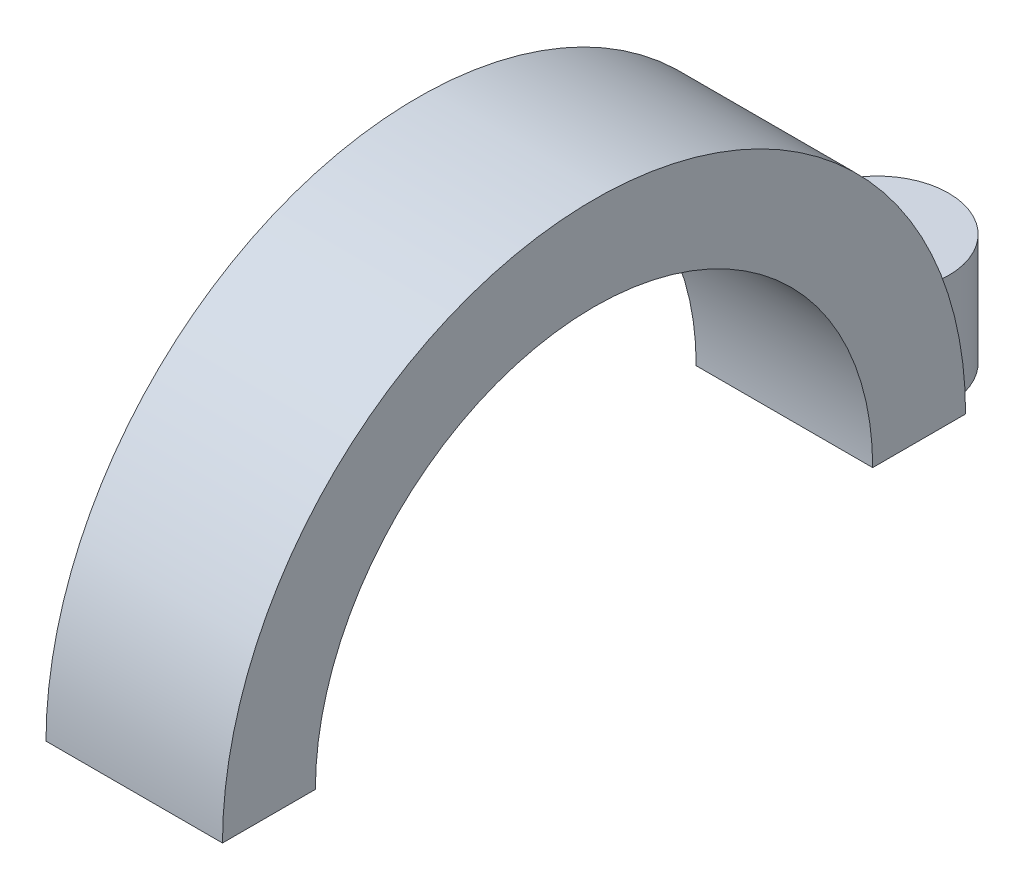
ISO-10303-21;
HEADER;
FILE_DESCRIPTION(('STEP AP214'),'2;1');
FILE_NAME('part.step','',(''),(''),'','','');
FILE_SCHEMA(('AUTOMOTIVE_DESIGN { 1 0 10303 214 1 1 1 1 }'));
ENDSEC;
DATA;
#1=APPLICATION_CONTEXT('core data for automotive mechanical design processes');
#2=APPLICATION_PROTOCOL_DEFINITION('international standard','automotive_design',2000,#1);
#3=PRODUCT_CONTEXT('',#1,'mechanical');
#4=PRODUCT('Part','Part','',(#3));
#5=PRODUCT_RELATED_PRODUCT_CATEGORY('part','',(#4));
#6=PRODUCT_DEFINITION_FORMATION('','',#4);
#7=PRODUCT_DEFINITION_CONTEXT('part definition',#1,'design');
#8=PRODUCT_DEFINITION('design','',#6,#7);
#9=PRODUCT_DEFINITION_SHAPE('','',#8);
#10=(LENGTH_UNIT() NAMED_UNIT(*) SI_UNIT(.MILLI.,.METRE.));
#11=(NAMED_UNIT(*) PLANE_ANGLE_UNIT() SI_UNIT($,.RADIAN.));
#12=(NAMED_UNIT(*) SI_UNIT($,.STERADIAN.) SOLID_ANGLE_UNIT());
#13=UNCERTAINTY_MEASURE_WITH_UNIT(LENGTH_MEASURE(1.E-05),#10,'distance_accuracy_value','');
#14=(GEOMETRIC_REPRESENTATION_CONTEXT(3) GLOBAL_UNCERTAINTY_ASSIGNED_CONTEXT((#13)) GLOBAL_UNIT_ASSIGNED_CONTEXT((#10,
#11,#12)) REPRESENTATION_CONTEXT('',''));
#15=CARTESIAN_POINT('',(0.,0.,0.));
#16=DIRECTION('',(0.,0.,1.));
#17=DIRECTION('',(1.,0.,0.));
#18=AXIS2_PLACEMENT_3D('',#15,#16,#17);
#19=CARTESIAN_POINT('',(120.65,0.,0.));
#20=DIRECTION('',(0.,1.,0.));
#21=DIRECTION('',(0.,0.,1.));
#22=AXIS2_PLACEMENT_3D('',#19,#20,#21);
#23=PLANE('',#22);
#24=DIRECTION('',(-1.,0.,0.));
#25=VECTOR('',#24,1.);
#26=CARTESIAN_POINT('',(120.65,0.,-508.));
#27=LINE('',#26,#25);
#28=CARTESIAN_POINT('',(-97.5,0.,-508.));
#29=VERTEX_POINT('',#28);
#30=CARTESIAN_POINT('',(-120.65,0.,-508.));
#31=VERTEX_POINT('',#30);
#32=EDGE_CURVE('E95',#29,#31,#27,.T.);
#33=ORIENTED_EDGE('',*,*,#32,.F.);
#34=CARTESIAN_POINT('',(0.,0.,-508.));
#35=DIRECTION('',(0.,-1.,0.));
#36=DIRECTION('',(0.,0.,-1.));
#37=AXIS2_PLACEMENT_3D('',#34,#35,#36);
#38=CIRCLE('',#37,97.5);
#39=CARTESIAN_POINT('',(97.5,0.,-508.));
#40=VERTEX_POINT('',#39);
#41=EDGE_CURVE('E98',#29,#40,#38,.T.);
#42=ORIENTED_EDGE('',*,*,#41,.T.);
#43=CARTESIAN_POINT('',(120.65,0.,-508.));
#44=VERTEX_POINT('',#43);
#45=EDGE_CURVE('E102',#44,#40,#27,.T.);
#46=ORIENTED_EDGE('',*,*,#45,.F.);
#47=DIRECTION('',(0.,0.,-1.));
#48=VECTOR('',#47,1.);
#49=CARTESIAN_POINT('',(120.65,0.,0.));
#50=LINE('',#49,#48);
#51=CARTESIAN_POINT('',(120.65,0.,-381.));
#52=VERTEX_POINT('',#51);
#53=EDGE_CURVE('E113',#52,#44,#50,.T.);
#54=ORIENTED_EDGE('',*,*,#53,.F.);
#55=DIRECTION('',(-1.,0.,0.));
#56=VECTOR('',#55,1.);
#57=CARTESIAN_POINT('',(120.65,0.,-381.));
#58=LINE('',#57,#56);
#59=CARTESIAN_POINT('',(-120.65,0.,-381.));
#60=VERTEX_POINT('',#59);
#61=EDGE_CURVE('E123',#52,#60,#58,.T.);
#62=ORIENTED_EDGE('',*,*,#61,.T.);
#63=DIRECTION('',(0.,0.,-1.));
#64=VECTOR('',#63,1.);
#65=CARTESIAN_POINT('',(-120.65,0.,0.));
#66=LINE('',#65,#64);
#67=EDGE_CURVE('E100',#60,#31,#66,.T.);
#68=ORIENTED_EDGE('',*,*,#67,.T.);
#69=EDGE_LOOP('',(#33,#42,#46,#54,#62,#68));
#70=FACE_BOUND('',#69,.T.);
#71=ADVANCED_FACE('F39',(#70),#23,.F.);
#72=CARTESIAN_POINT('',(120.65,0.,0.));
#73=DIRECTION('',(-1.,0.,0.));
#74=DIRECTION('',(0.,0.,1.));
#75=AXIS2_PLACEMENT_3D('',#72,#73,#74);
#76=CYLINDRICAL_SURFACE('',#75,508.);
#77=ORIENTED_EDGE('',*,*,#45,.T.);
#78=CARTESIAN_POINT('',(97.5,0.,-508.));
#79=CARTESIAN_POINT('',(97.4999970931986,1.61886356008947,-507.999999981574));
#80=CARTESIAN_POINT('',(97.5000003888945,3.23771696442745,-507.992261593465));
#81=CARTESIAN_POINT('',(97.4999940837196,6.475273841626,-507.961309102363));
#82=CARTESIAN_POINT('',(97.4999844828645,8.09397731466719,-507.938095018262));
#83=CARTESIAN_POINT('',(97.499898383887,12.9496402434581,-507.845241382301));
#84=CARTESIAN_POINT('',(97.4997645903566,16.1861863132922,-507.752390446735));
#85=CARTESIAN_POINT('',(97.4988207270217,22.6568386933033,-507.504827901568));
#86=CARTESIAN_POINT('',(97.4980106678843,25.8909450411578,-507.350117267733));
#87=CARTESIAN_POINT('',(97.4948296852726,32.3556132574334,-506.978891706361));
#88=CARTESIAN_POINT('',(97.4924587622608,35.5861751269043,-506.762376797138));
#89=CARTESIAN_POINT('',(97.4849450009961,42.0230465401967,-506.269117824298));
#90=CARTESIAN_POINT('',(97.4798190077263,45.22938462686,-505.992745805322));
#91=CARTESIAN_POINT('',(97.4652511796013,51.6362205137568,-505.379121778873));
#92=CARTESIAN_POINT('',(97.4558093461609,54.8367183159043,-505.041869791356));
#93=CARTESIAN_POINT('',(97.4307145005528,61.2307698089003,-504.30660234322));
#94=CARTESIAN_POINT('',(97.4150613609608,64.4243233559365,-503.908585636122));
#95=CARTESIAN_POINT('',(97.3753078875383,70.803241811036,-503.051942696053));
#96=CARTESIAN_POINT('',(97.351207550371,73.9886067158639,-502.593316439139));
#97=CARTESIAN_POINT('',(97.2919788945054,80.350239063708,-501.615586470765));
#98=CARTESIAN_POINT('',(97.2568495703504,83.5265056506247,-501.096477248096));
#99=CARTESIAN_POINT('',(97.1726391584366,89.8684218660912,-499.99802334187));
#100=CARTESIAN_POINT('',(97.1235580835921,93.0340715044658,-499.418678714071));
#101=CARTESIAN_POINT('',(97.0081707326237,99.3533290415878,-498.200030067581));
#102=CARTESIAN_POINT('',(96.9418653534774,102.506937558717,-497.560729172297));
#103=CARTESIAN_POINT('',(96.7883908880872,108.800950625558,-496.222434496268));
#104=CARTESIAN_POINT('',(96.7012218658329,111.941355215736,-495.523440898609));
#105=CARTESIAN_POINT('',(96.5013998416746,118.226696192779,-494.061658268883));
#106=CARTESIAN_POINT('',(96.3885946367657,121.371543377048,-493.298506107144));
#107=CARTESIAN_POINT('',(96.133315856983,127.644918425301,-491.71256070959));
#108=CARTESIAN_POINT('',(95.9908426353342,130.773446483123,-490.889768183924));
#109=CARTESIAN_POINT('',(95.6712755900551,137.013270598995,-489.184858645403));
#110=CARTESIAN_POINT('',(95.4941745799,140.124562941938,-488.30272934298));
#111=CARTESIAN_POINT('',(95.1985285510553,144.776715719523,-486.935637870764));
#112=CARTESIAN_POINT('',(95.0949774159144,146.325012867873,-486.47261066055));
#113=CARTESIAN_POINT('',(94.8771443904977,149.41644026332,-485.532015305733));
#114=CARTESIAN_POINT('',(94.7628624099546,150.959570466838,-485.054447038834));
#115=CARTESIAN_POINT('',(94.6428492108131,152.5,-484.569654435768));
#116=B_SPLINE_CURVE_WITH_KNOTS('',3,(#78,#79,#80,#81,#82,#83,#84,#85,#86,#87,#88,#89,#90,#91,
#92,#93,#94,#95,#96,#97,#98,#99,#100,#101,#102,#103,#104,#105,#106,#107,#108,#109,#110,#111,
#112,#113,#114,#115),.UNSPECIFIED.,.F.,.F.,(4,2,2,2,2,2,2,2,2,2,2,2,2,2,2,2,2,2,4),(0.,
4.85655187527478,9.71309782187967,19.426087418787,29.1389238108021,38.8517573248669,
48.5058694177782,58.1599783460631,67.8142853376546,77.4685961429784,87.1237873384607,
96.7789695967003,106.433649149754,116.088299091872,125.801840140562,135.515265547253,
145.230708986662,150.088707175885,154.946746233918),.UNSPECIFIED.);
#117=CARTESIAN_POINT('',(94.642849210813,152.5,-484.569654435768));
#118=VERTEX_POINT('',#117);
#119=EDGE_CURVE('E11',#40,#118,#116,.T.);
#120=ORIENTED_EDGE('',*,*,#119,.T.);
#121=DIRECTION('',(-1.,0.,0.));
#122=VECTOR('',#121,1.);
#123=CARTESIAN_POINT('',(120.65,152.5,-484.569654435768));
#124=LINE('',#123,#122);
#125=CARTESIAN_POINT('',(-94.642849210813,152.5,-484.569654435768));
#126=VERTEX_POINT('',#125);
#127=EDGE_CURVE('E62',#126,#118,#124,.F.);
#128=ORIENTED_EDGE('',*,*,#127,.F.);
#129=CARTESIAN_POINT('',(-94.642849210813,152.5,-484.569654435768));
#130=CARTESIAN_POINT('',(-94.7628624099546,150.959570466838,-485.054447038834));
#131=CARTESIAN_POINT('',(-94.8771443904976,149.41644026332,-485.532015305733));
#132=CARTESIAN_POINT('',(-95.0949774159144,146.325012867873,-486.472610660549));
#133=CARTESIAN_POINT('',(-95.1985285510553,144.776715719523,-486.935637870764));
#134=CARTESIAN_POINT('',(-95.4941745798999,140.124562941938,-488.30272934298));
#135=CARTESIAN_POINT('',(-95.6712755900551,137.013270598995,-489.184858645403));
#136=CARTESIAN_POINT('',(-95.9908426353341,130.773446483123,-490.889768183924));
#137=CARTESIAN_POINT('',(-96.133315856983,127.644918425301,-491.71256070959));
#138=CARTESIAN_POINT('',(-96.3885946367657,121.371543377048,-493.298506107144));
#139=CARTESIAN_POINT('',(-96.5013998416746,118.226696192779,-494.061658268883));
#140=CARTESIAN_POINT('',(-96.7012218658328,111.941355215736,-495.523440898609));
#141=CARTESIAN_POINT('',(-96.7883908880871,108.800950625558,-496.222434496269));
#142=CARTESIAN_POINT('',(-96.9418653534774,102.506937558717,-497.560729172297));
#143=CARTESIAN_POINT('',(-97.0081707326237,99.3533290415877,-498.200030067581));
#144=CARTESIAN_POINT('',(-97.123558083592,93.0340715044657,-499.418678714071));
#145=CARTESIAN_POINT('',(-97.1726391584365,89.8684218660911,-499.99802334187));
#146=CARTESIAN_POINT('',(-97.2568495703503,83.5265056506246,-501.096477248096));
#147=CARTESIAN_POINT('',(-97.2919788945054,80.3502390637079,-501.615586470765));
#148=CARTESIAN_POINT('',(-97.351207550371,73.9886067158639,-502.593316439139));
#149=CARTESIAN_POINT('',(-97.3753078875383,70.8032418110359,-503.051942696053));
#150=CARTESIAN_POINT('',(-97.4150613609607,64.4243233559365,-503.908585636122));
#151=CARTESIAN_POINT('',(-97.4307145005528,61.2307698089003,-504.30660234322));
#152=CARTESIAN_POINT('',(-97.4558093461609,54.8367183159043,-505.041869791356));
#153=CARTESIAN_POINT('',(-97.4652511796012,51.6362205137568,-505.379121778873));
#154=CARTESIAN_POINT('',(-97.4798190077262,45.22938462686,-505.992745805322));
#155=CARTESIAN_POINT('',(-97.4849450009961,42.0230465401966,-506.269117824298));
#156=CARTESIAN_POINT('',(-97.4924587622608,35.5861751269043,-506.762376797138));
#157=CARTESIAN_POINT('',(-97.4948296852725,32.3556132574333,-506.978891706361));
#158=CARTESIAN_POINT('',(-97.4980106678842,25.8909450411578,-507.350117267733));
#159=CARTESIAN_POINT('',(-97.4988207270217,22.6568386933032,-507.504827901568));
#160=CARTESIAN_POINT('',(-97.4997645903566,16.1861863132921,-507.752390446735));
#161=CARTESIAN_POINT('',(-97.4998983838869,12.949640243458,-507.845241382301));
#162=CARTESIAN_POINT('',(-97.4999844828645,8.09397731466711,-507.938095018262));
#163=CARTESIAN_POINT('',(-97.4999940837195,6.47527384162592,-507.961309102363));
#164=CARTESIAN_POINT('',(-97.5000003888944,3.23771696442738,-507.992261593465));
#165=CARTESIAN_POINT('',(-97.4999970931985,1.6188635600894,-507.999999981574));
#166=CARTESIAN_POINT('',(-97.5,0.,-508.));
#167=B_SPLINE_CURVE_WITH_KNOTS('',3,(#129,#130,#131,#132,#133,#134,#135,#136,#137,#138,#139,
#140,#141,#142,#143,#144,#145,#146,#147,#148,#149,#150,#151,#152,#153,#154,#155,#156,#157,#158,
#159,#160,#161,#162,#163,#164,#165,#166),.UNSPECIFIED.,.F.,.F.,(4,2,2,2,2,2,2,2,2,2,2,2,2,2,2,2,
2,2,4),(0.,4.85803905803301,9.71603724725596,19.4314806866648,29.144906093356,38.8584471420463,
48.5130970841641,58.1677766372177,67.8229588954573,77.4781500909396,87.1324608962634,
96.7867678878549,106.44087681614,116.094988909051,125.807822423116,135.520658815131,
145.233648412038,150.090194358643,154.946746233918),.UNSPECIFIED.);
#168=EDGE_CURVE('E53',#126,#29,#167,.T.);
#169=ORIENTED_EDGE('',*,*,#168,.T.);
#170=ORIENTED_EDGE('',*,*,#32,.T.);
#171=CARTESIAN_POINT('',(-120.65,0.,0.));
#172=DIRECTION('',(1.,0.,0.));
#173=DIRECTION('',(0.,0.,-1.));
#174=AXIS2_PLACEMENT_3D('',#171,#172,#173);
#175=CIRCLE('',#174,508.);
#176=CARTESIAN_POINT('',(-120.65,0.,508.));
#177=VERTEX_POINT('',#176);
#178=EDGE_CURVE('E125',#31,#177,#175,.T.);
#179=ORIENTED_EDGE('',*,*,#178,.T.);
#180=DIRECTION('',(-1.,0.,0.));
#181=VECTOR('',#180,1.);
#182=CARTESIAN_POINT('',(120.65,0.,508.));
#183=LINE('',#182,#181);
#184=CARTESIAN_POINT('',(120.65,0.,508.));
#185=VERTEX_POINT('',#184);
#186=EDGE_CURVE('E103',#185,#177,#183,.T.);
#187=ORIENTED_EDGE('',*,*,#186,.F.);
#188=CARTESIAN_POINT('',(120.65,0.,0.));
#189=DIRECTION('',(1.,0.,0.));
#190=DIRECTION('',(0.,0.,-1.));
#191=AXIS2_PLACEMENT_3D('',#188,#189,#190);
#192=CIRCLE('',#191,508.);
#193=EDGE_CURVE('E116',#44,#185,#192,.T.);
#194=ORIENTED_EDGE('',*,*,#193,.F.);
#195=EDGE_LOOP('',(#77,#120,#128,#169,#170,#179,#187,#194));
#196=FACE_BOUND('',#195,.T.);
#197=ADVANCED_FACE('F41',(#196),#76,.T.);
#198=CARTESIAN_POINT('',(-120.65,0.,381.));
#199=VERTEX_POINT('',#198);
#200=EDGE_CURVE('E126',#177,#199,#66,.T.);
#201=ORIENTED_EDGE('',*,*,#200,.T.);
#202=DIRECTION('',(-1.,0.,0.));
#203=VECTOR('',#202,1.);
#204=CARTESIAN_POINT('',(120.65,0.,381.));
#205=LINE('',#204,#203);
#206=CARTESIAN_POINT('',(120.65,0.,381.));
#207=VERTEX_POINT('',#206);
#208=EDGE_CURVE('E131',#207,#199,#205,.T.);
#209=ORIENTED_EDGE('',*,*,#208,.F.);
#210=EDGE_CURVE('E118',#185,#207,#50,.T.);
#211=ORIENTED_EDGE('',*,*,#210,.F.);
#212=ORIENTED_EDGE('',*,*,#186,.T.);
#213=EDGE_LOOP('',(#201,#209,#211,#212));
#214=FACE_BOUND('',#213,.T.);
#215=ADVANCED_FACE('F155',(#214),#23,.F.);
#216=CARTESIAN_POINT('',(120.65,0.,0.));
#217=DIRECTION('',(-1.,0.,0.));
#218=DIRECTION('',(0.,0.,1.));
#219=AXIS2_PLACEMENT_3D('',#216,#217,#218);
#220=CYLINDRICAL_SURFACE('',#219,381.);
#221=CARTESIAN_POINT('',(-120.65,0.,0.));
#222=DIRECTION('',(1.,0.,0.));
#223=DIRECTION('',(0.,0.,-1.));
#224=AXIS2_PLACEMENT_3D('',#221,#222,#223);
#225=CIRCLE('',#224,381.);
#226=EDGE_CURVE('E117',#60,#199,#225,.T.);
#227=ORIENTED_EDGE('',*,*,#226,.F.);
#228=ORIENTED_EDGE('',*,*,#61,.F.);
#229=CARTESIAN_POINT('',(120.65,0.,0.));
#230=DIRECTION('',(1.,0.,0.));
#231=DIRECTION('',(0.,0.,-1.));
#232=AXIS2_PLACEMENT_3D('',#229,#230,#231);
#233=CIRCLE('',#232,381.);
#234=EDGE_CURVE('E120',#52,#207,#233,.T.);
#235=ORIENTED_EDGE('',*,*,#234,.T.);
#236=ORIENTED_EDGE('',*,*,#208,.T.);
#237=EDGE_LOOP('',(#227,#228,#235,#236));
#238=FACE_BOUND('',#237,.T.);
#239=ADVANCED_FACE('F149',(#238),#220,.F.);
#240=CARTESIAN_POINT('',(120.65,0.,0.));
#241=DIRECTION('',(1.,0.,0.));
#242=DIRECTION('',(0.,0.,-1.));
#243=AXIS2_PLACEMENT_3D('',#240,#241,#242);
#244=PLANE('',#243);
#245=ORIENTED_EDGE('',*,*,#53,.T.);
#246=ORIENTED_EDGE('',*,*,#193,.T.);
#247=ORIENTED_EDGE('',*,*,#210,.T.);
#248=ORIENTED_EDGE('',*,*,#234,.F.);
#249=EDGE_LOOP('',(#245,#246,#247,#248));
#250=FACE_BOUND('',#249,.T.);
#251=ADVANCED_FACE('F145',(#250),#244,.T.);
#252=CARTESIAN_POINT('',(-120.65,0.,0.));
#253=DIRECTION('',(1.,0.,0.));
#254=DIRECTION('',(0.,0.,-1.));
#255=AXIS2_PLACEMENT_3D('',#252,#253,#254);
#256=PLANE('',#255);
#257=ORIENTED_EDGE('',*,*,#67,.F.);
#258=ORIENTED_EDGE('',*,*,#226,.T.);
#259=ORIENTED_EDGE('',*,*,#200,.F.);
#260=ORIENTED_EDGE('',*,*,#178,.F.);
#261=EDGE_LOOP('',(#257,#258,#259,#260));
#262=FACE_BOUND('',#261,.T.);
#263=ADVANCED_FACE('F144',(#262),#256,.F.);
#264=CARTESIAN_POINT('',(0.,152.5,-508.));
#265=DIRECTION('',(0.,-1.,0.));
#266=DIRECTION('',(0.,0.,-1.));
#267=AXIS2_PLACEMENT_3D('',#264,#265,#266);
#268=CYLINDRICAL_SURFACE('',#267,97.5);
#269=ORIENTED_EDGE('',*,*,#119,.F.);
#270=ORIENTED_EDGE('',*,*,#41,.F.);
#271=ORIENTED_EDGE('',*,*,#168,.F.);
#272=CARTESIAN_POINT('',(0.,152.5,-508.));
#273=DIRECTION('',(0.,-1.,0.));
#274=DIRECTION('',(0.,0.,-1.));
#275=AXIS2_PLACEMENT_3D('',#272,#273,#274);
#276=CIRCLE('',#275,97.5);
#277=EDGE_CURVE('E109',#126,#118,#276,.T.);
#278=ORIENTED_EDGE('',*,*,#277,.T.);
#279=EDGE_LOOP('',(#269,#270,#271,#278));
#280=FACE_BOUND('',#279,.T.);
#281=ADVANCED_FACE('F108',(#280),#268,.T.);
#282=CARTESIAN_POINT('',(0.,152.5,-508.));
#283=DIRECTION('',(0.,-1.,0.));
#284=DIRECTION('',(0.,0.,-1.));
#285=AXIS2_PLACEMENT_3D('',#282,#283,#284);
#286=PLANE('',#285);
#287=ORIENTED_EDGE('',*,*,#277,.F.);
#288=ORIENTED_EDGE('',*,*,#127,.T.);
#289=EDGE_LOOP('',(#287,#288));
#290=FACE_BOUND('',#289,.T.);
#291=ADVANCED_FACE('F143',(#290),#286,.F.);
#292=CLOSED_SHELL('',(#71,#197,#215,#239,#251,#263,#281,#291));
#293=MANIFOLD_SOLID_BREP('B2',#292);
#294=ADVANCED_BREP_SHAPE_REPRESENTATION('',(#18,#293),#14);
#295=SHAPE_DEFINITION_REPRESENTATION(#9,#294);
ENDSEC;
END-ISO-10303-21;
